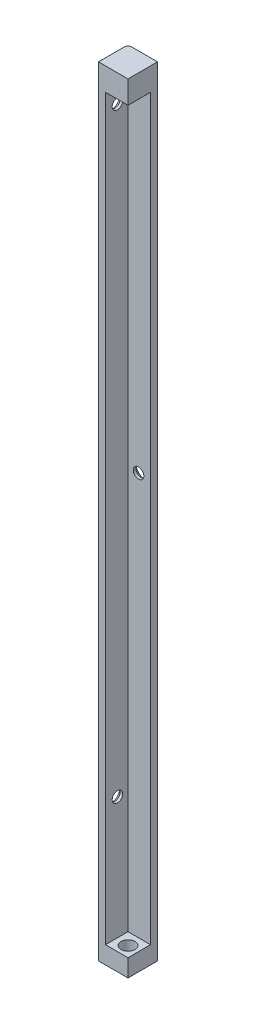
ISO-10303-21;
HEADER;
FILE_DESCRIPTION(('STEP AP214'),'2;1');
FILE_NAME('part.step','',(''),(''),'','','');
FILE_SCHEMA(('AUTOMOTIVE_DESIGN { 1 0 10303 214 1 1 1 1 }'));
ENDSEC;
DATA;
#1=APPLICATION_CONTEXT('core data for automotive mechanical design processes');
#2=APPLICATION_PROTOCOL_DEFINITION('international standard','automotive_design',2000,#1);
#3=PRODUCT_CONTEXT('',#1,'mechanical');
#4=PRODUCT('Part','Part','',(#3));
#5=PRODUCT_RELATED_PRODUCT_CATEGORY('part','',(#4));
#6=PRODUCT_DEFINITION_FORMATION('','',#4);
#7=PRODUCT_DEFINITION_CONTEXT('part definition',#1,'design');
#8=PRODUCT_DEFINITION('design','',#6,#7);
#9=PRODUCT_DEFINITION_SHAPE('','',#8);
#10=(LENGTH_UNIT() NAMED_UNIT(*) SI_UNIT(.MILLI.,.METRE.));
#11=(NAMED_UNIT(*) PLANE_ANGLE_UNIT() SI_UNIT($,.RADIAN.));
#12=(NAMED_UNIT(*) SI_UNIT($,.STERADIAN.) SOLID_ANGLE_UNIT());
#13=UNCERTAINTY_MEASURE_WITH_UNIT(LENGTH_MEASURE(1.E-05),#10,'distance_accuracy_value','');
#14=(GEOMETRIC_REPRESENTATION_CONTEXT(3) GLOBAL_UNCERTAINTY_ASSIGNED_CONTEXT((#13)) GLOBAL_UNIT_ASSIGNED_CONTEXT((#10,
#11,#12)) REPRESENTATION_CONTEXT('',''));
#15=CARTESIAN_POINT('',(0.,0.,0.));
#16=DIRECTION('',(0.,0.,1.));
#17=DIRECTION('',(1.,0.,0.));
#18=AXIS2_PLACEMENT_3D('',#15,#16,#17);
#19=CARTESIAN_POINT('',(2.,221.5,0.));
#20=DIRECTION('',(-1.,0.,0.));
#21=DIRECTION('',(0.,0.,1.));
#22=AXIS2_PLACEMENT_3D('',#19,#20,#21);
#23=PLANE('',#22);
#24=CARTESIAN_POINT('',(2.,211.,-3.99999999999892));
#25=DIRECTION('',(-1.,0.,0.));
#26=DIRECTION('',(0.,0.,1.));
#27=AXIS2_PLACEMENT_3D('',#24,#25,#26);
#28=CIRCLE('',#27,1.5);
#29=CARTESIAN_POINT('',(2.,211.,-2.49999999999892));
#30=VERTEX_POINT('',#29);
#31=EDGE_CURVE('E188',#30,#30,#28,.T.);
#32=ORIENTED_EDGE('',*,*,#31,.T.);
#33=EDGE_LOOP('',(#32));
#34=FACE_BOUND('',#33,.T.);
#35=CARTESIAN_POINT('',(2.,40.2499999999992,-3.99999999999953));
#36=DIRECTION('',(-1.,0.,0.));
#37=DIRECTION('',(0.,0.,1.));
#38=AXIS2_PLACEMENT_3D('',#35,#36,#37);
#39=CIRCLE('',#38,1.5);
#40=CARTESIAN_POINT('',(2.,40.2499999999992,-2.49999999999953));
#41=VERTEX_POINT('',#40);
#42=EDGE_CURVE('E195',#41,#41,#39,.T.);
#43=ORIENTED_EDGE('',*,*,#42,.T.);
#44=EDGE_LOOP('',(#43));
#45=FACE_BOUND('',#44,.T.);
#46=DIRECTION('',(0.,0.,1.));
#47=VECTOR('',#46,1.);
#48=CARTESIAN_POINT('',(2.,215.5,0.));
#49=LINE('',#48,#47);
#50=CARTESIAN_POINT('',(2.,215.5,-7.));
#51=VERTEX_POINT('',#50);
#52=CARTESIAN_POINT('',(2.,215.5,-0.599999999999999));
#53=VERTEX_POINT('',#52);
#54=EDGE_CURVE('E167',#51,#53,#49,.T.);
#55=ORIENTED_EDGE('',*,*,#54,.T.);
#56=DIRECTION('',(0.,-1.,0.));
#57=VECTOR('',#56,1.);
#58=CARTESIAN_POINT('',(2.,221.5,-0.6));
#59=LINE('',#58,#57);
#60=CARTESIAN_POINT('',(2.,5.50000000000001,-0.599999999999973));
#61=VERTEX_POINT('',#60);
#62=EDGE_CURVE('E156',#53,#61,#59,.T.);
#63=ORIENTED_EDGE('',*,*,#62,.T.);
#64=DIRECTION('',(0.,0.,-1.));
#65=VECTOR('',#64,1.);
#66=CARTESIAN_POINT('',(2.,5.50000000000001,0.));
#67=LINE('',#66,#65);
#68=CARTESIAN_POINT('',(2.,5.50000000000001,-7.));
#69=VERTEX_POINT('',#68);
#70=EDGE_CURVE('E173',#61,#69,#67,.T.);
#71=ORIENTED_EDGE('',*,*,#70,.T.);
#72=DIRECTION('',(0.,-1.,0.));
#73=VECTOR('',#72,1.);
#74=CARTESIAN_POINT('',(2.,221.5,-7.));
#75=LINE('',#74,#73);
#76=EDGE_CURVE('E196',#51,#69,#75,.T.);
#77=ORIENTED_EDGE('',*,*,#76,.F.);
#78=EDGE_LOOP('',(#55,#63,#71,#77));
#79=FACE_BOUND('',#78,.T.);
#80=ADVANCED_FACE('F37',(#34,#45,#79),#23,.F.);
#81=CARTESIAN_POINT('',(2.,221.5,-7.));
#82=DIRECTION('',(0.,0.,-1.));
#83=DIRECTION('',(-1.,0.,0.));
#84=AXIS2_PLACEMENT_3D('',#81,#82,#83);
#85=PLANE('',#84);
#86=CARTESIAN_POINT('',(5.,120.,-7.));
#87=DIRECTION('',(0.,0.,-1.));
#88=DIRECTION('',(-1.,0.,0.));
#89=AXIS2_PLACEMENT_3D('',#86,#87,#88);
#90=CIRCLE('',#89,1.5);
#91=CARTESIAN_POINT('',(3.5,120.,-7.));
#92=VERTEX_POINT('',#91);
#93=EDGE_CURVE('E181',#92,#92,#90,.T.);
#94=ORIENTED_EDGE('',*,*,#93,.T.);
#95=EDGE_LOOP('',(#94));
#96=FACE_BOUND('',#95,.T.);
#97=DIRECTION('',(1.,0.,0.));
#98=VECTOR('',#97,1.);
#99=CARTESIAN_POINT('',(1.,5.5,-7.));
#100=LINE('',#99,#98);
#101=CARTESIAN_POINT('',(8.4,5.50000000000001,-7.));
#102=VERTEX_POINT('',#101);
#103=EDGE_CURVE('E170',#69,#102,#100,.T.);
#104=ORIENTED_EDGE('',*,*,#103,.T.);
#105=DIRECTION('',(0.,1.,0.));
#106=VECTOR('',#105,1.);
#107=CARTESIAN_POINT('',(8.4,221.5,-7.));
#108=LINE('',#107,#106);
#109=CARTESIAN_POINT('',(8.4,215.5,-7.));
#110=VERTEX_POINT('',#109);
#111=EDGE_CURVE('E148',#102,#110,#108,.T.);
#112=ORIENTED_EDGE('',*,*,#111,.T.);
#113=DIRECTION('',(-1.,0.,0.));
#114=VECTOR('',#113,1.);
#115=CARTESIAN_POINT('',(2.,215.5,-7.));
#116=LINE('',#115,#114);
#117=EDGE_CURVE('E165',#110,#51,#116,.T.);
#118=ORIENTED_EDGE('',*,*,#117,.T.);
#119=ORIENTED_EDGE('',*,*,#76,.T.);
#120=EDGE_LOOP('',(#104,#112,#118,#119));
#121=FACE_BOUND('',#120,.T.);
#122=ADVANCED_FACE('F229',(#96,#121),#85,.F.);
#123=CARTESIAN_POINT('',(0.,221.5,-9.));
#124=DIRECTION('',(0.,0.,1.));
#125=DIRECTION('',(1.,0.,0.));
#126=AXIS2_PLACEMENT_3D('',#123,#124,#125);
#127=PLANE('',#126);
#128=CARTESIAN_POINT('',(5.,120.,-9.));
#129=DIRECTION('',(0.,0.,-1.));
#130=DIRECTION('',(-1.,0.,0.));
#131=AXIS2_PLACEMENT_3D('',#128,#129,#130);
#132=CIRCLE('',#131,2.75);
#133=CARTESIAN_POINT('',(2.25,120.,-9.));
#134=VERTEX_POINT('',#133);
#135=EDGE_CURVE('E175',#134,#134,#132,.T.);
#136=ORIENTED_EDGE('',*,*,#135,.F.);
#137=EDGE_LOOP('',(#136));
#138=FACE_BOUND('',#137,.T.);
#139=DIRECTION('',(1.,0.,0.));
#140=VECTOR('',#139,1.);
#141=CARTESIAN_POINT('',(1.00000000000001,0.499999999999996,-9.));
#142=LINE('',#141,#140);
#143=CARTESIAN_POINT('',(1.,0.499999999999996,-9.));
#144=VERTEX_POINT('',#143);
#145=CARTESIAN_POINT('',(8.4,0.499999999999996,-9.));
#146=VERTEX_POINT('',#145);
#147=EDGE_CURVE('E130',#144,#146,#142,.T.);
#148=ORIENTED_EDGE('',*,*,#147,.F.);
#149=DIRECTION('',(0.,1.,0.));
#150=VECTOR('',#149,1.);
#151=CARTESIAN_POINT('',(1.,221.5,-9.));
#152=LINE('',#151,#150);
#153=CARTESIAN_POINT('',(0.999999999999999,222.,-9.));
#154=VERTEX_POINT('',#153);
#155=EDGE_CURVE('E117',#144,#154,#152,.T.);
#156=ORIENTED_EDGE('',*,*,#155,.T.);
#157=DIRECTION('',(-1.,0.,0.));
#158=VECTOR('',#157,1.);
#159=CARTESIAN_POINT('',(9.,222.,-9.));
#160=LINE('',#159,#158);
#161=CARTESIAN_POINT('',(8.4,222.,-9.));
#162=VERTEX_POINT('',#161);
#163=EDGE_CURVE('E161',#162,#154,#160,.T.);
#164=ORIENTED_EDGE('',*,*,#163,.F.);
#165=DIRECTION('',(0.,1.,0.));
#166=VECTOR('',#165,1.);
#167=CARTESIAN_POINT('',(8.4,222.,-9.));
#168=LINE('',#167,#166);
#169=EDGE_CURVE('E141',#146,#162,#168,.T.);
#170=ORIENTED_EDGE('',*,*,#169,.F.);
#171=EDGE_LOOP('',(#148,#156,#164,#170));
#172=FACE_BOUND('',#171,.T.);
#173=ADVANCED_FACE('F214',(#138,#172),#127,.F.);
#174=CARTESIAN_POINT('',(0.,221.5,0.));
#175=DIRECTION('',(1.,0.,0.));
#176=DIRECTION('',(0.,0.,-1.));
#177=AXIS2_PLACEMENT_3D('',#174,#175,#176);
#178=PLANE('',#177);
#179=CARTESIAN_POINT('',(0.,211.,-3.99999999999892));
#180=DIRECTION('',(-1.,0.,0.));
#181=DIRECTION('',(0.,0.,1.));
#182=AXIS2_PLACEMENT_3D('',#179,#180,#181);
#183=CIRCLE('',#182,2.75);
#184=CARTESIAN_POINT('',(0.,211.,-1.24999999999892));
#185=VERTEX_POINT('',#184);
#186=EDGE_CURVE('E182',#185,#185,#183,.T.);
#187=ORIENTED_EDGE('',*,*,#186,.F.);
#188=EDGE_LOOP('',(#187));
#189=FACE_BOUND('',#188,.T.);
#190=CARTESIAN_POINT('',(0.,40.2499999999992,-3.99999999999953));
#191=DIRECTION('',(-1.,0.,0.));
#192=DIRECTION('',(0.,0.,1.));
#193=AXIS2_PLACEMENT_3D('',#190,#191,#192);
#194=CIRCLE('',#193,2.75);
#195=CARTESIAN_POINT('',(0.,40.2499999999992,-1.24999999999953));
#196=VERTEX_POINT('',#195);
#197=EDGE_CURVE('E189',#196,#196,#194,.T.);
#198=ORIENTED_EDGE('',*,*,#197,.F.);
#199=EDGE_LOOP('',(#198));
#200=FACE_BOUND('',#199,.T.);
#201=DIRECTION('',(0.,0.,-1.));
#202=VECTOR('',#201,1.);
#203=CARTESIAN_POINT('',(0.,222.,1.));
#204=LINE('',#203,#202);
#205=CARTESIAN_POINT('',(0.,222.,-0.6));
#206=VERTEX_POINT('',#205);
#207=CARTESIAN_POINT('',(0.,222.,-8.));
#208=VERTEX_POINT('',#207);
#209=EDGE_CURVE('E163',#206,#208,#204,.T.);
#210=ORIENTED_EDGE('',*,*,#209,.T.);
#211=DIRECTION('',(0.,1.,0.));
#212=VECTOR('',#211,1.);
#213=CARTESIAN_POINT('',(0.,221.5,-8.));
#214=LINE('',#213,#212);
#215=CARTESIAN_POINT('',(0.,0.499999999999996,-8.));
#216=VERTEX_POINT('',#215);
#217=EDGE_CURVE('E45',#208,#216,#214,.F.);
#218=ORIENTED_EDGE('',*,*,#217,.T.);
#219=DIRECTION('',(0.,0.,-1.));
#220=VECTOR('',#219,1.);
#221=CARTESIAN_POINT('',(0.,0.499999999999997,-0.599999999999972));
#222=LINE('',#221,#220);
#223=CARTESIAN_POINT('',(0.,0.499999999999997,-0.599999999999972));
#224=VERTEX_POINT('',#223);
#225=EDGE_CURVE('E126',#224,#216,#222,.T.);
#226=ORIENTED_EDGE('',*,*,#225,.F.);
#227=DIRECTION('',(0.,-1.,0.));
#228=VECTOR('',#227,1.);
#229=CARTESIAN_POINT('',(0.,222.,-0.6));
#230=LINE('',#229,#228);
#231=EDGE_CURVE('E124',#206,#224,#230,.T.);
#232=ORIENTED_EDGE('',*,*,#231,.F.);
#233=EDGE_LOOP('',(#210,#218,#226,#232));
#234=FACE_BOUND('',#233,.T.);
#235=ADVANCED_FACE('F256',(#189,#200,#234),#178,.F.);
#236=CARTESIAN_POINT('',(0.,40.2499999999992,-3.99999999999953));
#237=DIRECTION('',(-1.,0.,0.));
#238=DIRECTION('',(0.,0.,1.));
#239=AXIS2_PLACEMENT_3D('',#236,#237,#238);
#240=CYLINDRICAL_SURFACE('',#239,1.5);
#241=CARTESIAN_POINT('',(1.25,40.2499999999992,-3.99999999999953));
#242=DIRECTION('',(-1.,0.,0.));
#243=DIRECTION('',(0.,0.,1.));
#244=AXIS2_PLACEMENT_3D('',#241,#242,#243);
#245=CIRCLE('',#244,1.5);
#246=CARTESIAN_POINT('',(1.25,40.2499999999992,-2.49999999999953));
#247=VERTEX_POINT('',#246);
#248=EDGE_CURVE('E192',#247,#247,#245,.T.);
#249=ORIENTED_EDGE('',*,*,#248,.T.);
#250=EDGE_LOOP('',(#249));
#251=FACE_BOUND('',#250,.T.);
#252=ORIENTED_EDGE('',*,*,#42,.F.);
#253=EDGE_LOOP('',(#252));
#254=FACE_BOUND('',#253,.T.);
#255=ADVANCED_FACE('F260',(#251,#254),#240,.F.);
#256=CARTESIAN_POINT('',(0.,40.2499999999992,-3.99999999999953));
#257=DIRECTION('',(-1.,0.,0.));
#258=DIRECTION('',(0.,0.,1.));
#259=AXIS2_PLACEMENT_3D('',#256,#257,#258);
#260=CONICAL_SURFACE('',#259,2.75,0.785398163397449);
#261=ORIENTED_EDGE('',*,*,#248,.F.);
#262=EDGE_LOOP('',(#261));
#263=FACE_BOUND('',#262,.T.);
#264=ORIENTED_EDGE('',*,*,#197,.T.);
#265=EDGE_LOOP('',(#264));
#266=FACE_BOUND('',#265,.T.);
#267=ADVANCED_FACE('F264',(#263,#266),#260,.F.);
#268=CARTESIAN_POINT('',(0.,211.,-3.99999999999892));
#269=DIRECTION('',(-1.,0.,0.));
#270=DIRECTION('',(0.,0.,1.));
#271=AXIS2_PLACEMENT_3D('',#268,#269,#270);
#272=CYLINDRICAL_SURFACE('',#271,1.5);
#273=CARTESIAN_POINT('',(1.25,211.,-3.99999999999892));
#274=DIRECTION('',(-1.,0.,0.));
#275=DIRECTION('',(0.,0.,1.));
#276=AXIS2_PLACEMENT_3D('',#273,#274,#275);
#277=CIRCLE('',#276,1.5);
#278=CARTESIAN_POINT('',(1.25,211.,-2.49999999999892));
#279=VERTEX_POINT('',#278);
#280=EDGE_CURVE('E185',#279,#279,#277,.T.);
#281=ORIENTED_EDGE('',*,*,#280,.T.);
#282=EDGE_LOOP('',(#281));
#283=FACE_BOUND('',#282,.T.);
#284=ORIENTED_EDGE('',*,*,#31,.F.);
#285=EDGE_LOOP('',(#284));
#286=FACE_BOUND('',#285,.T.);
#287=ADVANCED_FACE('F268',(#283,#286),#272,.F.);
#288=CARTESIAN_POINT('',(0.,211.,-3.99999999999892));
#289=DIRECTION('',(-1.,0.,0.));
#290=DIRECTION('',(0.,0.,1.));
#291=AXIS2_PLACEMENT_3D('',#288,#289,#290);
#292=CONICAL_SURFACE('',#291,2.75,0.785398163397449);
#293=ORIENTED_EDGE('',*,*,#280,.F.);
#294=EDGE_LOOP('',(#293));
#295=FACE_BOUND('',#294,.T.);
#296=ORIENTED_EDGE('',*,*,#186,.T.);
#297=EDGE_LOOP('',(#296));
#298=FACE_BOUND('',#297,.T.);
#299=ADVANCED_FACE('F272',(#295,#298),#292,.F.);
#300=CARTESIAN_POINT('',(5.,120.,-9.));
#301=DIRECTION('',(0.,0.,-1.));
#302=DIRECTION('',(-1.,0.,0.));
#303=AXIS2_PLACEMENT_3D('',#300,#301,#302);
#304=CYLINDRICAL_SURFACE('',#303,1.5);
#305=CARTESIAN_POINT('',(5.,120.,-7.75));
#306=DIRECTION('',(0.,0.,-1.));
#307=DIRECTION('',(-1.,0.,0.));
#308=AXIS2_PLACEMENT_3D('',#305,#306,#307);
#309=CIRCLE('',#308,1.5);
#310=CARTESIAN_POINT('',(3.5,120.,-7.75));
#311=VERTEX_POINT('',#310);
#312=EDGE_CURVE('E178',#311,#311,#309,.T.);
#313=ORIENTED_EDGE('',*,*,#312,.T.);
#314=EDGE_LOOP('',(#313));
#315=FACE_BOUND('',#314,.T.);
#316=ORIENTED_EDGE('',*,*,#93,.F.);
#317=EDGE_LOOP('',(#316));
#318=FACE_BOUND('',#317,.T.);
#319=ADVANCED_FACE('F241',(#315,#318),#304,.F.);
#320=CARTESIAN_POINT('',(5.,120.,-9.));
#321=DIRECTION('',(0.,0.,-1.));
#322=DIRECTION('',(-1.,0.,0.));
#323=AXIS2_PLACEMENT_3D('',#320,#321,#322);
#324=CONICAL_SURFACE('',#323,2.75,0.785398163397449);
#325=ORIENTED_EDGE('',*,*,#312,.F.);
#326=EDGE_LOOP('',(#325));
#327=FACE_BOUND('',#326,.T.);
#328=ORIENTED_EDGE('',*,*,#135,.T.);
#329=EDGE_LOOP('',(#328));
#330=FACE_BOUND('',#329,.T.);
#331=ADVANCED_FACE('F233',(#327,#330),#324,.F.);
#332=CARTESIAN_POINT('',(0.,5.5,0.));
#333=DIRECTION('',(0.,1.,0.));
#334=DIRECTION('',(0.,0.,1.));
#335=AXIS2_PLACEMENT_3D('',#332,#333,#334);
#336=PLANE('',#335);
#337=CARTESIAN_POINT('',(5.40000000000021,5.5,-3.59999999999996));
#338=DIRECTION('',(0.,1.,0.));
#339=DIRECTION('',(0.,0.,1.));
#340=AXIS2_PLACEMENT_3D('',#337,#338,#339);
#341=CIRCLE('',#340,1.99999999999998);
#342=CARTESIAN_POINT('',(5.40000000000021,5.5,-1.59999999999998));
#343=VERTEX_POINT('',#342);
#344=EDGE_CURVE('E132',#343,#343,#341,.T.);
#345=ORIENTED_EDGE('',*,*,#344,.F.);
#346=EDGE_LOOP('',(#345));
#347=FACE_BOUND('',#346,.T.);
#348=DIRECTION('',(0.,0.,1.));
#349=VECTOR('',#348,1.);
#350=CARTESIAN_POINT('',(8.4,5.5,0.));
#351=LINE('',#350,#349);
#352=CARTESIAN_POINT('',(8.4,5.5,-0.599999999999973));
#353=VERTEX_POINT('',#352);
#354=EDGE_CURVE('E114',#102,#353,#351,.T.);
#355=ORIENTED_EDGE('',*,*,#354,.F.);
#356=ORIENTED_EDGE('',*,*,#103,.F.);
#357=ORIENTED_EDGE('',*,*,#70,.F.);
#358=DIRECTION('',(-1.,0.,0.));
#359=VECTOR('',#358,1.);
#360=CARTESIAN_POINT('',(0.,5.5,-0.599999999999973));
#361=LINE('',#360,#359);
#362=EDGE_CURVE('E159',#353,#61,#361,.T.);
#363=ORIENTED_EDGE('',*,*,#362,.F.);
#364=EDGE_LOOP('',(#355,#356,#357,#363));
#365=FACE_BOUND('',#364,.T.);
#366=ADVANCED_FACE('F231',(#347,#365),#336,.T.);
#367=CARTESIAN_POINT('',(0.,215.5,0.));
#368=DIRECTION('',(0.,-1.,0.));
#369=DIRECTION('',(0.,0.,-1.));
#370=AXIS2_PLACEMENT_3D('',#367,#368,#369);
#371=PLANE('',#370);
#372=DIRECTION('',(0.,0.,-1.));
#373=VECTOR('',#372,1.);
#374=CARTESIAN_POINT('',(8.4,215.5,0.));
#375=LINE('',#374,#373);
#376=CARTESIAN_POINT('',(8.4,215.5,-0.599999999999999));
#377=VERTEX_POINT('',#376);
#378=EDGE_CURVE('E146',#377,#110,#375,.T.);
#379=ORIENTED_EDGE('',*,*,#378,.F.);
#380=DIRECTION('',(1.,0.,0.));
#381=VECTOR('',#380,1.);
#382=CARTESIAN_POINT('',(0.,215.5,-0.599999999999999));
#383=LINE('',#382,#381);
#384=EDGE_CURVE('E153',#53,#377,#383,.T.);
#385=ORIENTED_EDGE('',*,*,#384,.F.);
#386=ORIENTED_EDGE('',*,*,#54,.F.);
#387=ORIENTED_EDGE('',*,*,#117,.F.);
#388=EDGE_LOOP('',(#379,#385,#386,#387));
#389=FACE_BOUND('',#388,.T.);
#390=ADVANCED_FACE('F222',(#389),#371,.T.);
#391=CARTESIAN_POINT('',(9.,222.,1.));
#392=DIRECTION('',(0.,-1.,0.));
#393=DIRECTION('',(0.,0.,-1.));
#394=AXIS2_PLACEMENT_3D('',#391,#392,#393);
#395=PLANE('',#394);
#396=ORIENTED_EDGE('',*,*,#163,.T.);
#397=CARTESIAN_POINT('',(1.,222.,-8.));
#398=DIRECTION('',(0.,-1.,0.));
#399=DIRECTION('',(0.,0.,-1.));
#400=AXIS2_PLACEMENT_3D('',#397,#398,#399);
#401=CIRCLE('',#400,1.);
#402=EDGE_CURVE('E59',#154,#208,#401,.F.);
#403=ORIENTED_EDGE('',*,*,#402,.T.);
#404=ORIENTED_EDGE('',*,*,#209,.F.);
#405=DIRECTION('',(1.,0.,0.));
#406=VECTOR('',#405,1.);
#407=CARTESIAN_POINT('',(9.,222.,-0.6));
#408=LINE('',#407,#406);
#409=CARTESIAN_POINT('',(8.4,222.,-0.6));
#410=VERTEX_POINT('',#409);
#411=EDGE_CURVE('E199',#206,#410,#408,.T.);
#412=ORIENTED_EDGE('',*,*,#411,.T.);
#413=DIRECTION('',(0.,0.,-1.));
#414=VECTOR('',#413,1.);
#415=CARTESIAN_POINT('',(8.4,222.,1.));
#416=LINE('',#415,#414);
#417=EDGE_CURVE('E143',#410,#162,#416,.T.);
#418=ORIENTED_EDGE('',*,*,#417,.T.);
#419=EDGE_LOOP('',(#396,#403,#404,#412,#418));
#420=FACE_BOUND('',#419,.T.);
#421=ADVANCED_FACE('F217',(#420),#395,.F.);
#422=CARTESIAN_POINT('',(10.,222.,-0.6));
#423=DIRECTION('',(0.,0.,-1.));
#424=DIRECTION('',(0.,1.,0.));
#425=AXIS2_PLACEMENT_3D('',#422,#423,#424);
#426=PLANE('',#425);
#427=ORIENTED_EDGE('',*,*,#231,.T.);
#428=DIRECTION('',(-1.,0.,0.));
#429=VECTOR('',#428,1.);
#430=CARTESIAN_POINT('',(8.4,0.499999999999997,-0.599999999999972));
#431=LINE('',#430,#429);
#432=CARTESIAN_POINT('',(8.4,0.499999999999997,-0.599999999999972));
#433=VERTEX_POINT('',#432);
#434=EDGE_CURVE('E121',#433,#224,#431,.T.);
#435=ORIENTED_EDGE('',*,*,#434,.F.);
#436=DIRECTION('',(0.,1.,0.));
#437=VECTOR('',#436,1.);
#438=CARTESIAN_POINT('',(8.4,222.,-0.6));
#439=LINE('',#438,#437);
#440=EDGE_CURVE('E108',#433,#353,#439,.T.);
#441=ORIENTED_EDGE('',*,*,#440,.T.);
#442=ORIENTED_EDGE('',*,*,#362,.T.);
#443=ORIENTED_EDGE('',*,*,#62,.F.);
#444=ORIENTED_EDGE('',*,*,#384,.T.);
#445=EDGE_CURVE('E118',#377,#410,#439,.T.);
#446=ORIENTED_EDGE('',*,*,#445,.T.);
#447=ORIENTED_EDGE('',*,*,#411,.F.);
#448=EDGE_LOOP('',(#427,#435,#441,#442,#443,#444,#446,#447));
#449=FACE_BOUND('',#448,.T.);
#450=ADVANCED_FACE('F122',(#449),#426,.F.);
#451=CARTESIAN_POINT('',(8.4,222.,1.));
#452=DIRECTION('',(-1.,0.,0.));
#453=DIRECTION('',(0.,-1.,0.));
#454=AXIS2_PLACEMENT_3D('',#451,#452,#453);
#455=PLANE('',#454);
#456=ORIENTED_EDGE('',*,*,#440,.F.);
#457=DIRECTION('',(0.,0.,1.));
#458=VECTOR('',#457,1.);
#459=CARTESIAN_POINT('',(8.4,0.499999999999996,-9.));
#460=LINE('',#459,#458);
#461=EDGE_CURVE('E112',#146,#433,#460,.T.);
#462=ORIENTED_EDGE('',*,*,#461,.F.);
#463=ORIENTED_EDGE('',*,*,#169,.T.);
#464=ORIENTED_EDGE('',*,*,#417,.F.);
#465=ORIENTED_EDGE('',*,*,#445,.F.);
#466=ORIENTED_EDGE('',*,*,#378,.T.);
#467=ORIENTED_EDGE('',*,*,#111,.F.);
#468=ORIENTED_EDGE('',*,*,#354,.T.);
#469=EDGE_LOOP('',(#456,#462,#463,#464,#465,#466,#467,#468));
#470=FACE_BOUND('',#469,.T.);
#471=ADVANCED_FACE('F110',(#470),#455,.F.);
#472=CARTESIAN_POINT('',(0.,0.499999999999997,0.));
#473=DIRECTION('',(0.,-1.,0.));
#474=DIRECTION('',(0.,0.,-1.));
#475=AXIS2_PLACEMENT_3D('',#472,#473,#474);
#476=PLANE('',#475);
#477=CARTESIAN_POINT('',(5.40000000000021,0.499999999999995,-3.59999999999996));
#478=DIRECTION('',(0.,-1.,0.));
#479=DIRECTION('',(0.,0.,-1.));
#480=AXIS2_PLACEMENT_3D('',#477,#478,#479);
#481=CIRCLE('',#480,1.99999999999999);
#482=CARTESIAN_POINT('',(5.40000000000021,0.499999999999995,-5.59999999999995));
#483=VERTEX_POINT('',#482);
#484=EDGE_CURVE('E135',#483,#483,#481,.T.);
#485=ORIENTED_EDGE('',*,*,#484,.F.);
#486=EDGE_LOOP('',(#485));
#487=FACE_BOUND('',#486,.T.);
#488=ORIENTED_EDGE('',*,*,#225,.T.);
#489=CARTESIAN_POINT('',(1.,0.5,-8.));
#490=DIRECTION('',(0.,-1.,0.));
#491=DIRECTION('',(0.,0.,-1.));
#492=AXIS2_PLACEMENT_3D('',#489,#490,#491);
#493=CIRCLE('',#492,1.);
#494=EDGE_CURVE('E11',#216,#144,#493,.T.);
#495=ORIENTED_EDGE('',*,*,#494,.T.);
#496=ORIENTED_EDGE('',*,*,#147,.T.);
#497=ORIENTED_EDGE('',*,*,#461,.T.);
#498=ORIENTED_EDGE('',*,*,#434,.T.);
#499=EDGE_LOOP('',(#488,#495,#496,#497,#498));
#500=FACE_BOUND('',#499,.T.);
#501=ADVANCED_FACE('F128',(#487,#500),#476,.T.);
#502=CARTESIAN_POINT('',(5.40000000000021,0.499999999999997,-3.59999999999996));
#503=DIRECTION('',(0.,-1.,0.));
#504=DIRECTION('',(0.,0.,-1.));
#505=AXIS2_PLACEMENT_3D('',#502,#503,#504);
#506=CYLINDRICAL_SURFACE('',#505,1.99999999999998);
#507=ORIENTED_EDGE('',*,*,#484,.T.);
#508=EDGE_LOOP('',(#507));
#509=FACE_BOUND('',#508,.T.);
#510=ORIENTED_EDGE('',*,*,#344,.T.);
#511=EDGE_LOOP('',(#510));
#512=FACE_BOUND('',#511,.T.);
#513=ADVANCED_FACE('F343',(#509,#512),#506,.F.);
#514=CARTESIAN_POINT('',(1.,221.5,-8.));
#515=DIRECTION('',(0.,1.,0.));
#516=DIRECTION('',(0.,0.,1.));
#517=AXIS2_PLACEMENT_3D('',#514,#515,#516);
#518=CYLINDRICAL_SURFACE('',#517,1.);
#519=ORIENTED_EDGE('',*,*,#494,.F.);
#520=ORIENTED_EDGE('',*,*,#217,.F.);
#521=ORIENTED_EDGE('',*,*,#402,.F.);
#522=ORIENTED_EDGE('',*,*,#155,.F.);
#523=EDGE_LOOP('',(#519,#520,#521,#522));
#524=FACE_BOUND('',#523,.T.);
#525=ADVANCED_FACE('F39',(#524),#518,.T.);
#526=CLOSED_SHELL('',(#80,#122,#173,#235,#255,#267,#287,#299,#319,#331,#366,#390,#421,#450,#471,
#501,#513,#525));
#527=MANIFOLD_SOLID_BREP('B2',#526);
#528=ADVANCED_BREP_SHAPE_REPRESENTATION('',(#18,#527),#14);
#529=SHAPE_DEFINITION_REPRESENTATION(#9,#528);
ENDSEC;
END-ISO-10303-21;
